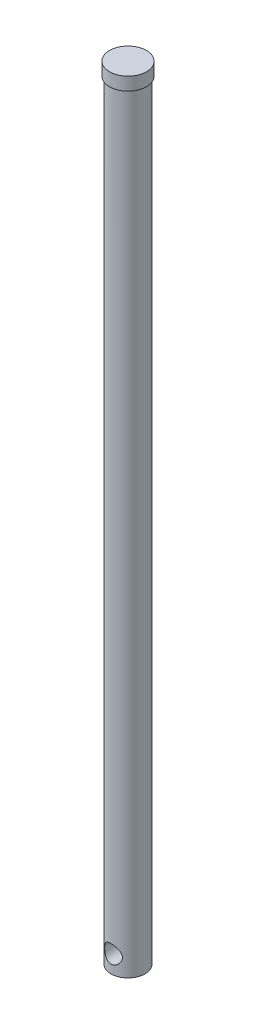
ISO-10303-21;
HEADER;
FILE_DESCRIPTION(('STEP AP214'),'2;1');
FILE_NAME('part.step','',(''),(''),'','','');
FILE_SCHEMA(('AUTOMOTIVE_DESIGN { 1 0 10303 214 1 1 1 1 }'));
ENDSEC;
DATA;
#1=APPLICATION_CONTEXT('core data for automotive mechanical design processes');
#2=APPLICATION_PROTOCOL_DEFINITION('international standard','automotive_design',2000,#1);
#3=PRODUCT_CONTEXT('',#1,'mechanical');
#4=PRODUCT('Part','Part','',(#3));
#5=PRODUCT_RELATED_PRODUCT_CATEGORY('part','',(#4));
#6=PRODUCT_DEFINITION_FORMATION('','',#4);
#7=PRODUCT_DEFINITION_CONTEXT('part definition',#1,'design');
#8=PRODUCT_DEFINITION('design','',#6,#7);
#9=PRODUCT_DEFINITION_SHAPE('','',#8);
#10=(LENGTH_UNIT() NAMED_UNIT(*) SI_UNIT(.MILLI.,.METRE.));
#11=(NAMED_UNIT(*) PLANE_ANGLE_UNIT() SI_UNIT($,.RADIAN.));
#12=(NAMED_UNIT(*) SI_UNIT($,.STERADIAN.) SOLID_ANGLE_UNIT());
#13=UNCERTAINTY_MEASURE_WITH_UNIT(LENGTH_MEASURE(1.E-05),#10,'distance_accuracy_value','');
#14=(GEOMETRIC_REPRESENTATION_CONTEXT(3) GLOBAL_UNCERTAINTY_ASSIGNED_CONTEXT((#13)) GLOBAL_UNIT_ASSIGNED_CONTEXT((#10,
#11,#12)) REPRESENTATION_CONTEXT('',''));
#15=CARTESIAN_POINT('',(0.,0.,0.));
#16=DIRECTION('',(0.,0.,1.));
#17=DIRECTION('',(1.,0.,0.));
#18=AXIS2_PLACEMENT_3D('',#15,#16,#17);
#19=CARTESIAN_POINT('',(0.,228.6,0.));
#20=DIRECTION('',(0.,-1.,0.));
#21=DIRECTION('',(0.,0.,-1.));
#22=AXIS2_PLACEMENT_3D('',#19,#20,#21);
#23=CYLINDRICAL_SURFACE('',#22,4.953);
#24=CARTESIAN_POINT('',(0.,7.67079999999999,-4.953));
#25=CARTESIAN_POINT('',(-0.135434407992874,7.67078952112055,-4.95299094755821));
#26=CARTESIAN_POINT('',(-0.271013501715402,7.66011716862036,-4.94738613543832));
#27=CARTESIAN_POINT('',(-0.538112978653829,7.61791888940756,-4.92551367096733));
#28=CARTESIAN_POINT('',(-0.669626246729192,7.58635835633592,-4.90922832411603));
#29=CARTESIAN_POINT('',(-0.924337177029192,7.50398234635794,-4.86768922872622));
#30=CARTESIAN_POINT('',(-1.04756581183996,7.45324389591742,-4.84247138195342));
#31=CARTESIAN_POINT('',(-1.28355118153246,7.33437667219869,-4.7853388344657));
#32=CARTESIAN_POINT('',(-1.396308128607,7.26624825140665,-4.7534242694923));
#33=CARTESIAN_POINT('',(-1.61631460941087,7.10957365276831,-4.68336501820389));
#34=CARTESIAN_POINT('',(-1.72274188619885,7.01999516173222,-4.64495148005103));
#35=CARTESIAN_POINT('',(-1.91983171882484,6.82519630077396,-4.56702407196095));
#36=CARTESIAN_POINT('',(-2.01048103428423,6.71996292978075,-4.52750930985845));
#37=CARTESIAN_POINT('',(-2.18135982309519,6.48595174992201,-4.44786628527983));
#38=CARTESIAN_POINT('',(-2.26000015853437,6.35592279053664,-4.40798289594909));
#39=CARTESIAN_POINT('',(-2.39398650695367,6.08209977723835,-4.33668656791211));
#40=CARTESIAN_POINT('',(-2.44935016673179,5.93831625299477,-4.30526721886033));
#41=CARTESIAN_POINT('',(-2.51152868783542,5.72011792939713,-4.26906830591823));
#42=CARTESIAN_POINT('',(-2.52852001062029,5.6493490011117,-4.25899715855717));
#43=CARTESIAN_POINT('',(-2.55653083397504,5.50625959666403,-4.2422435689365));
#44=CARTESIAN_POINT('',(-2.56755365374685,5.43394000616834,-4.23555924333185));
#45=CARTESIAN_POINT('',(-2.58343794445899,5.28843364099261,-4.22588989690386));
#46=CARTESIAN_POINT('',(-2.5883040188757,5.21524755558098,-4.22290211216722));
#47=CARTESIAN_POINT('',(-2.59181345309312,5.0686941033745,-4.22074751244465));
#48=CARTESIAN_POINT('',(-2.59045751323245,4.99532675791102,-4.22158026742571));
#49=CARTESIAN_POINT('',(-2.57825855918049,4.79565155653579,-4.2290565917176));
#50=CARTESIAN_POINT('',(-2.56121212909891,4.66979770398041,-4.23949854475852));
#51=CARTESIAN_POINT('',(-2.5093331412265,4.42317405969048,-4.27040196425953));
#52=CARTESIAN_POINT('',(-2.47449393811196,4.30240618574476,-4.29086717413281));
#53=CARTESIAN_POINT('',(-2.38746128743706,4.06584102842881,-4.33990498359995));
#54=CARTESIAN_POINT('',(-2.33488947446559,3.95022038616934,-4.36865215682474));
#55=CARTESIAN_POINT('',(-2.21418407789162,3.72887082979859,-4.43105044104316));
#56=CARTESIAN_POINT('',(-2.14604353449103,3.62314636953421,-4.46470374281502));
#57=CARTESIAN_POINT('',(-1.98499263213196,3.40894271542151,-4.53882378149797));
#58=CARTESIAN_POINT('',(-1.88994708714945,3.30216417206384,-4.57958341639906));
#59=CARTESIAN_POINT('',(-1.6832258525028,3.1053148467459,-4.65953294636479));
#60=CARTESIAN_POINT('',(-1.57154079258425,3.01525354340521,-4.69872194106864));
#61=CARTESIAN_POINT('',(-1.32695650129679,2.84966172834347,-4.77374310197551));
#62=CARTESIAN_POINT('',(-1.19322604959601,2.77520913442667,-4.80927012197356));
#63=CARTESIAN_POINT('',(-0.91281778153468,2.65049492754065,-4.87026579135199));
#64=CARTESIAN_POINT('',(-0.766151262445107,2.60021244920647,-4.89574311292645));
#65=CARTESIAN_POINT('',(-0.477822332693854,2.52970872604301,-4.93184771320455));
#66=CARTESIAN_POINT('',(-0.336850843475756,2.50723607914872,-4.94358225175026));
#67=CARTESIAN_POINT('',(-0.0526746630076387,2.48582590384199,-4.95475629186877));
#68=CARTESIAN_POINT('',(0.0905287713398937,2.48687557580309,-4.95420248012634));
#69=CARTESIAN_POINT('',(0.361891872583512,2.51129909350982,-4.94146799824639));
#70=CARTESIAN_POINT('',(0.490281106656086,2.53273350140553,-4.93029747790539));
#71=CARTESIAN_POINT('',(0.741346980819398,2.59416896175222,-4.89883922154227));
#72=CARTESIAN_POINT('',(0.864023014633658,2.63417197975948,-4.8785505203341));
#73=CARTESIAN_POINT('',(1.10395707667502,2.73249465504105,-4.82999731875451));
#74=CARTESIAN_POINT('',(1.22098847387362,2.79126739119235,-4.80153750556981));
#75=CARTESIAN_POINT('',(1.44388296552316,2.92492356856314,-4.73928511247375));
#76=CARTESIAN_POINT('',(1.54974152905531,2.99981350866252,-4.70549038285312));
#77=CARTESIAN_POINT('',(1.75908558708493,3.17260267713155,-4.6315659276384));
#78=CARTESIAN_POINT('',(1.86115768297873,3.27209136992651,-4.5911435260756));
#79=CARTESIAN_POINT('',(2.04785933403459,3.48664937051477,-4.51096732764431));
#80=CARTESIAN_POINT('',(2.13247400045246,3.60173184018457,-4.47121412782781));
#81=CARTESIAN_POINT('',(2.2868432268886,3.85296061622615,-4.39436528355432));
#82=CARTESIAN_POINT('',(2.3553707897296,3.98996517178754,-4.35758136551379));
#83=CARTESIAN_POINT('',(2.46768133354743,4.27605833052359,-4.29499074202228));
#84=CARTESIAN_POINT('',(2.51149871935443,4.42512979993947,-4.26916878630801));
#85=CARTESIAN_POINT('',(2.56888873577791,4.71561821308858,-4.23486013369095));
#86=CARTESIAN_POINT('',(2.5850013284734,4.8563568017344,-4.22492439014973));
#87=CARTESIAN_POINT('',(2.59397659950792,5.13882142154633,-4.21942422885448));
#88=CARTESIAN_POINT('',(2.5868530465231,5.28054681830729,-4.22385130034544));
#89=CARTESIAN_POINT('',(2.5519837599723,5.54396630781038,-4.24498628978715));
#90=CARTESIAN_POINT('',(2.52666059714731,5.66611354224307,-4.26024916399422));
#91=CARTESIAN_POINT('',(2.45931062999921,5.90423020583303,-4.29947787114859));
#92=CARTESIAN_POINT('',(2.41727794645893,6.02019744426488,-4.32344676703868));
#93=CARTESIAN_POINT('',(2.31465792178813,6.25115931992097,-4.37929018898568));
#94=CARTESIAN_POINT('',(2.25303244106533,6.36558882344834,-4.41158084768433));
#95=CARTESIAN_POINT('',(2.11404599840523,6.58324686275621,-4.47984546673599));
#96=CARTESIAN_POINT('',(2.03667658157849,6.68646933420897,-4.51582140099767));
#97=CARTESIAN_POINT('',(1.85596748101528,6.89356119739297,-4.59331201857542));
#98=CARTESIAN_POINT('',(1.75052042242816,6.99557253415382,-4.63490882258244));
#99=CARTESIAN_POINT('',(1.52307119960076,7.180965338379,-4.71455286882302));
#100=CARTESIAN_POINT('',(1.40105902187744,7.26433545606138,-4.75259794040427));
#101=CARTESIAN_POINT('',(1.14043186822572,7.41117195804239,-4.82182959417504));
#102=CARTESIAN_POINT('',(1.00155261732912,7.4742437135081,-4.85287703693892));
#103=CARTESIAN_POINT('',(0.785490151686321,7.55003903273763,-4.89086896186443));
#104=CARTESIAN_POINT('',(0.712228270999206,7.57216057045795,-4.90209859875253));
#105=CARTESIAN_POINT('',(0.56365594959222,7.60990056319134,-4.92139138577324));
#106=CARTESIAN_POINT('',(0.488346708037132,7.62552274111358,-4.9294563485173));
#107=CARTESIAN_POINT('',(0.344363775374576,7.64873549288647,-4.94148551932617));
#108=CARTESIAN_POINT('',(0.275826349536611,7.65699855041382,-4.94579209960719));
#109=CARTESIAN_POINT('',(0.138205185779743,7.66803353546449,-4.95155167983894));
#110=CARTESIAN_POINT('',(0.0691214364598831,7.67080534808849,-4.95300462007985));
#111=CARTESIAN_POINT('',(0.,7.67079999999999,-4.953));
#112=B_SPLINE_CURVE_WITH_KNOTS('',3,(#24,#25,#26,#27,#28,#29,#30,#31,#32,#33,#34,#35,#36,#37,
#38,#39,#40,#41,#42,#43,#44,#45,#46,#47,#48,#49,#50,#51,#52,#53,#54,#55,#56,#57,#58,#59,#60,#61,
#62,#63,#64,#65,#66,#67,#68,#69,#70,#71,#72,#73,#74,#75,#76,#77,#78,#79,#80,#81,#82,#83,#84,#85,
#86,#87,#88,#89,#90,#91,#92,#93,#94,#95,#96,#97,#98,#99,#100,#101,#102,#103,#104,#105,#106,#107,
#108,#109,#110,#111),.UNSPECIFIED.,.T.,.F.,(4,2,2,2,2,2,2,2,2,2,2,2,2,2,2,2,2,2,2,2,2,2,2,2,2,2,
2,2,2,2,2,2,2,2,2,2,2,2,2,2,2,2,2,4),(0.,0.40603491361986,0.812744212544292,1.21783706327424,
1.62292170362262,2.05409249785827,2.48562339091417,2.9546395672218,3.4232995232541,
3.64344276109151,3.86346344687526,4.08331952299962,4.30315085313085,4.68347170362396,
5.0639347020236,5.4530915516653,5.84242271037106,6.28646447664561,6.73075724916252,
7.19960035146302,7.66803798487886,8.09535461862589,8.52243873446278,8.91256977168582,
9.30274211514771,9.70315243280984,10.1037245099506,10.5463099974695,10.9892714022046,
11.4593532775918,11.9287790155281,12.3522704114358,12.7755109113269,13.1509004164362,
13.5264221187868,13.9266309363963,14.3270552461003,14.7824722738954,15.2381658336918,
15.7022476135282,15.9339909795945,16.1656014169761,16.3728244533302,16.5800518255925),.UNSPECIFIED.);
#113=CARTESIAN_POINT('',(0.,7.67079999999999,-4.953));
#114=VERTEX_POINT('',#113);
#115=EDGE_CURVE('E45',#114,#114,#112,.T.);
#116=ORIENTED_EDGE('',*,*,#115,.T.);
#117=EDGE_LOOP('',(#116));
#118=FACE_BOUND('',#117,.T.);
#119=CARTESIAN_POINT('',(2.59079999999999,5.08,4.2213699624648));
#120=CARTESIAN_POINT('',(2.59078832671894,4.94599740104169,4.22138483155383));
#121=CARTESIAN_POINT('',(2.58033187106073,4.81184249253368,4.2278502402607));
#122=CARTESIAN_POINT('',(2.53907252333815,4.54773419727038,4.25274729112539));
#123=CARTESIAN_POINT('',(2.50823086029321,4.41778931263011,4.27120173428998));
#124=CARTESIAN_POINT('',(2.42795042003139,4.16642725482374,4.31733426925371));
#125=CARTESIAN_POINT('',(2.37861798435808,4.04496594272247,4.34495951728018));
#126=CARTESIAN_POINT('',(2.26308201451216,3.81207950151802,4.40623795034252));
#127=CARTESIAN_POINT('',(2.19687627668066,3.70065568588978,4.43989192256107));
#128=CARTESIAN_POINT('',(2.04243726296212,3.47985851122549,4.51315837049116));
#129=CARTESIAN_POINT('',(1.95275013564548,3.37158907773616,4.55303441959687));
#130=CARTESIAN_POINT('',(1.75690814881966,3.17075781790369,4.63213141579228));
#131=CARTESIAN_POINT('',(1.65074443814384,3.0782044904931,4.67135199814961));
#132=CARTESIAN_POINT('',(1.41518284174805,2.90457405335406,4.74825540559866));
#133=CARTESIAN_POINT('',(1.28463591486026,2.82489104810909,4.78559854151186));
#134=CARTESIAN_POINT('',(1.00966832804024,2.68912717585647,4.85105046728886));
#135=CARTESIAN_POINT('',(0.865257321870596,2.6330300299967,4.87916562331255));
#136=CARTESIAN_POINT('',(0.578386861815757,2.55052427588923,4.9210823606692));
#137=CARTESIAN_POINT('',(0.436626572498353,2.52216930663841,4.93581604545757));
#138=CARTESIAN_POINT('',(0.149657986806267,2.48950581794469,4.95281917294147));
#139=CARTESIAN_POINT('',(0.00445207365888748,2.4851811379068,4.95509699230699));
#140=CARTESIAN_POINT('',(-0.270496255170813,2.50003562370672,4.94733882026443));
#141=CARTESIAN_POINT('',(-0.40039769705848,2.51702184771054,4.93845161565199));
#142=CARTESIAN_POINT('',(-0.655192299742309,2.57003932757373,4.91114562282726));
#143=CARTESIAN_POINT('',(-0.780085081325501,2.60607202255144,4.8927261143728));
#144=CARTESIAN_POINT('',(-1.02335708011996,2.69629708484109,4.84772742865779));
#145=CARTESIAN_POINT('',(-1.14163396701107,2.75071331337521,4.82104802042376));
#146=CARTESIAN_POINT('',(-1.36764121324187,2.87579833406023,4.76187293742561));
#147=CARTESIAN_POINT('',(-1.47536792824659,2.94647271421323,4.72937526375015));
#148=CARTESIAN_POINT('',(-1.68882454601191,3.11023222620501,4.65768168011404));
#149=CARTESIAN_POINT('',(-1.79325752905677,3.20485863250961,4.61814077855509));
#150=CARTESIAN_POINT('',(-1.98549751460079,3.4097233453686,4.53881539582432));
#151=CARTESIAN_POINT('',(-2.07328964153339,3.51997546763131,4.49903072923105));
#152=CARTESIAN_POINT('',(-2.23623976821303,3.76304072293309,4.4204331287871));
#153=CARTESIAN_POINT('',(-2.30997675426405,3.89692092510737,4.38191139372067));
#154=CARTESIAN_POINT('',(-2.40247497491795,4.10724897966894,4.33146139735931));
#155=CARTESIAN_POINT('',(-2.43029329366845,4.17895704015949,4.31586463603707));
#156=CARTESIAN_POINT('',(-2.47957444185047,4.32509084865423,4.28774128367156));
#157=CARTESIAN_POINT('',(-2.50104136782712,4.39951480999199,4.2752127145966));
#158=CARTESIAN_POINT('',(-2.53584089783621,4.5444119672798,4.25465573711517));
#159=CARTESIAN_POINT('',(-2.5496885514883,4.61472203159709,4.24634660025701));
#160=CARTESIAN_POINT('',(-2.57152777976006,4.75653095484727,4.23315688122977));
#161=CARTESIAN_POINT('',(-2.5795225489596,4.82802914345846,4.22827442879234));
#162=CARTESIAN_POINT('',(-2.58952845136904,4.97156785970009,4.22215442149639));
#163=CARTESIAN_POINT('',(-2.59154262011011,5.04360809358656,4.22091501756467));
#164=CARTESIAN_POINT('',(-2.58956873072732,5.18755178861003,4.22212478901927));
#165=CARTESIAN_POINT('',(-2.58558117763941,5.25945526074554,4.22457365404328));
#166=CARTESIAN_POINT('',(-2.5664361187488,5.4560168650101,4.23625523408484));
#167=CARTESIAN_POINT('',(-2.54515618244181,5.57992248658881,4.24919113453736));
#168=CARTESIAN_POINT('',(-2.48540189223353,5.82203727604404,4.28440842500238));
#169=CARTESIAN_POINT('',(-2.4469212127421,5.94024433053374,4.30669325290659));
#170=CARTESIAN_POINT('',(-2.35209278742112,6.17384726381136,4.35923458766652));
#171=CARTESIAN_POINT('',(-2.29501600836066,6.28887451999413,4.38980591020882));
#172=CARTESIAN_POINT('',(-2.16523022382433,6.50839340944099,4.45525144094195));
#173=CARTESIAN_POINT('',(-2.09251319372357,6.61287959376252,4.49012785403923));
#174=CARTESIAN_POINT('',(-1.92160140321405,6.82373112017973,4.56613333547405));
#175=CARTESIAN_POINT('',(-1.82126257149102,6.92829843122012,4.60745250125705));
#176=CARTESIAN_POINT('',(-1.60395094275988,7.11974618608324,4.68753261970799));
#177=CARTESIAN_POINT('',(-1.48697079397725,7.20661877128785,4.72629243056789));
#178=CARTESIAN_POINT('',(-1.23404827226985,7.36303661885776,4.79867011981334));
#179=CARTESIAN_POINT('',(-1.09756964388129,7.43183374088915,4.83204869437095));
#180=CARTESIAN_POINT('',(-0.812728767811574,7.54477695988099,4.88801283434845));
#181=CARTESIAN_POINT('',(-0.664378037597934,7.58894662493917,4.91060871564404));
#182=CARTESIAN_POINT('',(-0.375498501446054,7.64725844118155,4.94067073702701));
#183=CARTESIAN_POINT('',(-0.235603253055459,7.66389403066068,4.94939003540938));
#184=CARTESIAN_POINT('',(0.0452409559789972,7.67420801311856,4.95478071347714));
#185=CARTESIAN_POINT('',(0.186189445802367,7.66789611536338,4.95145718857972));
#186=CARTESIAN_POINT('',(0.453765136693692,7.63404386368441,4.93385516699142));
#187=CARTESIAN_POINT('',(0.58066475368152,7.60815918354714,4.92043146825401));
#188=CARTESIAN_POINT('',(0.828065231325609,7.53826823409754,4.88488932365526));
#189=CARTESIAN_POINT('',(0.94856524853077,7.49425958275004,4.86276973490967));
#190=CARTESIAN_POINT('',(1.18514967269437,7.38763253321757,4.81070531549984));
#191=CARTESIAN_POINT('',(1.30087103000042,7.32434703843598,4.78048562834144));
#192=CARTESIAN_POINT('',(1.52049325919445,7.18178712037749,4.71523654378115));
#193=CARTESIAN_POINT('',(1.62438885636174,7.10250560566517,4.68020501537628));
#194=CARTESIAN_POINT('',(1.82919183846662,6.92038860569326,4.60428413798412));
#195=CARTESIAN_POINT('',(1.92858494906651,6.81593922880044,4.56316940646045));
#196=CARTESIAN_POINT('',(2.10907983072146,6.59155854164565,4.48260856778202));
#197=CARTESIAN_POINT('',(2.19016268389521,6.47161141862103,4.4431642203085));
#198=CARTESIAN_POINT('',(2.33519595616667,6.21230349740104,4.36875849389533));
#199=CARTESIAN_POINT('',(2.39817031080441,6.07229795571459,4.33409221140452));
#200=CARTESIAN_POINT('',(2.4735859382502,5.85429875268214,4.2912011266241));
#201=CARTESIAN_POINT('',(2.49553920946564,5.78036900990611,4.2784293909852));
#202=CARTESIAN_POINT('',(2.53284502226249,5.63036301387145,4.2564512771342));
#203=CARTESIAN_POINT('',(2.54820201495479,5.55428824511318,4.24724249508994));
#204=CARTESIAN_POINT('',(2.57030178804721,5.41195409162861,4.23389886592984));
#205=CARTESIAN_POINT('',(2.57797687088609,5.3458892340923,4.22921837705718));
#206=CARTESIAN_POINT('',(2.5882290228515,5.21322882423977,4.22295014129594));
#207=CARTESIAN_POINT('',(2.59080580457818,5.14663324221816,4.22136256876035));
#208=CARTESIAN_POINT('',(2.59079999999999,5.08,4.2213699624648));
#209=B_SPLINE_CURVE_WITH_KNOTS('',3,(#119,#120,#121,#122,#123,#124,#125,#126,#127,#128,#129,
#130,#131,#132,#133,#134,#135,#136,#137,#138,#139,#140,#141,#142,#143,#144,#145,#146,#147,#148,
#149,#150,#151,#152,#153,#154,#155,#156,#157,#158,#159,#160,#161,#162,#163,#164,#165,#166,#167,
#168,#169,#170,#171,#172,#173,#174,#175,#176,#177,#178,#179,#180,#181,#182,#183,#184,#185,#186,
#187,#188,#189,#190,#191,#192,#193,#194,#195,#196,#197,#198,#199,#200,#201,#202,#203,#204,#205,
#206,#207,#208),.UNSPECIFIED.,.T.,.F.,(4,2,2,2,2,2,2,2,2,2,2,2,2,2,2,2,2,2,2,2,2,2,2,2,2,2,2,2,
2,2,2,2,2,2,2,2,2,2,2,2,2,2,2,2,4),(0.,0.40173670075462,0.804239678646085,1.2044624959857,
1.6047376093671,2.04134144161473,2.47818063306364,2.94800243542002,3.41749943448252,
3.85100241296775,4.28421382131552,4.67628720682084,5.06839022094715,5.46545123333923,
5.86264892188438,6.2999020331048,6.73754418834264,7.20766296609447,7.44280899147124,
7.67780301919248,7.89391277074791,8.10990447868984,8.32578653848911,8.54165043315069,
8.91891242492822,9.29631326946049,9.69077419021103,10.0854379839335,10.5355444190056,
10.9858503224854,11.452591574282,11.9188853918536,12.3400277387744,12.7609919177288,
13.1498517687639,13.5387627440034,13.9430530802682,14.3475230439273,14.7953519700703,
15.2436414906692,15.7128506522927,15.9470439453977,16.1810789577028,16.3808326207709,
16.5805975439694),.UNSPECIFIED.);
#210=CARTESIAN_POINT('',(2.59079999999999,5.08,4.2213699624648));
#211=VERTEX_POINT('',#210);
#212=EDGE_CURVE('E10',#211,#211,#209,.T.);
#213=ORIENTED_EDGE('',*,*,#212,.T.);
#214=EDGE_LOOP('',(#213));
#215=FACE_BOUND('',#214,.T.);
#216=CARTESIAN_POINT('',(0.,0.,0.));
#217=DIRECTION('',(0.,1.,0.));
#218=DIRECTION('',(0.,0.,1.));
#219=AXIS2_PLACEMENT_3D('',#216,#217,#218);
#220=CIRCLE('',#219,4.953);
#221=CARTESIAN_POINT('',(0.,0.,4.953));
#222=VERTEX_POINT('',#221);
#223=EDGE_CURVE('E59',#222,#222,#220,.T.);
#224=ORIENTED_EDGE('',*,*,#223,.T.);
#225=EDGE_LOOP('',(#224));
#226=FACE_BOUND('',#225,.T.);
#227=CARTESIAN_POINT('',(0.,224.79,0.));
#228=DIRECTION('',(0.,1.,0.));
#229=DIRECTION('',(0.,0.,1.));
#230=AXIS2_PLACEMENT_3D('',#227,#228,#229);
#231=CIRCLE('',#230,4.953);
#232=CARTESIAN_POINT('',(0.,224.79,4.953));
#233=VERTEX_POINT('',#232);
#234=EDGE_CURVE('E54',#233,#233,#231,.T.);
#235=ORIENTED_EDGE('',*,*,#234,.F.);
#236=EDGE_LOOP('',(#235));
#237=FACE_BOUND('',#236,.T.);
#238=ADVANCED_FACE('F41',(#118,#215,#226,#237),#23,.T.);
#239=CARTESIAN_POINT('',(0.,0.,0.));
#240=DIRECTION('',(0.,1.,0.));
#241=DIRECTION('',(0.,0.,1.));
#242=AXIS2_PLACEMENT_3D('',#239,#240,#241);
#243=PLANE('',#242);
#244=ORIENTED_EDGE('',*,*,#223,.F.);
#245=EDGE_LOOP('',(#244));
#246=FACE_BOUND('',#245,.T.);
#247=ADVANCED_FACE('F79',(#246),#243,.F.);
#248=CARTESIAN_POINT('',(0.,224.79,0.));
#249=DIRECTION('',(0.,1.,0.));
#250=DIRECTION('',(0.,0.,1.));
#251=AXIS2_PLACEMENT_3D('',#248,#249,#250);
#252=CYLINDRICAL_SURFACE('',#251,5.3975);
#253=CARTESIAN_POINT('',(0.,224.79,0.));
#254=DIRECTION('',(0.,1.,0.));
#255=DIRECTION('',(0.,0.,1.));
#256=AXIS2_PLACEMENT_3D('',#253,#254,#255);
#257=CIRCLE('',#256,5.3975);
#258=CARTESIAN_POINT('',(0.,224.79,5.3975));
#259=VERTEX_POINT('',#258);
#260=EDGE_CURVE('E93',#259,#259,#257,.T.);
#261=CARTESIAN_POINT('',(0.,228.6,0.));
#262=DIRECTION('',(0.,1.,0.));
#263=DIRECTION('',(0.,0.,1.));
#264=AXIS2_PLACEMENT_3D('',#261,#262,#263);
#265=CIRCLE('',#264,5.3975);
#266=CARTESIAN_POINT('',(0.,228.6,5.3975));
#267=VERTEX_POINT('',#266);
#268=EDGE_CURVE('E96',#267,#267,#265,.T.);
#269=CARTESIAN_POINT('',(0.,224.79,5.3975));
#270=CARTESIAN_POINT('',(0.,224.8296875,5.3975));
#271=CARTESIAN_POINT('',(0.,224.869375,5.3975));
#272=CARTESIAN_POINT('',(0.,224.94875,5.3975));
#273=CARTESIAN_POINT('',(0.,224.9884375,5.3975));
#274=CARTESIAN_POINT('',(0.,225.0678125,5.3975));
#275=CARTESIAN_POINT('',(0.,225.1075,5.3975));
#276=CARTESIAN_POINT('',(0.,225.186875,5.3975));
#277=CARTESIAN_POINT('',(0.,225.2265625,5.3975));
#278=CARTESIAN_POINT('',(0.,225.3059375,5.3975));
#279=CARTESIAN_POINT('',(0.,225.345625,5.3975));
#280=CARTESIAN_POINT('',(0.,225.425,5.3975));
#281=CARTESIAN_POINT('',(0.,225.4646875,5.3975));
#282=CARTESIAN_POINT('',(0.,225.5440625,5.3975));
#283=CARTESIAN_POINT('',(0.,225.58375,5.3975));
#284=CARTESIAN_POINT('',(0.,225.663125,5.3975));
#285=CARTESIAN_POINT('',(0.,225.7028125,5.3975));
#286=CARTESIAN_POINT('',(0.,225.7821875,5.3975));
#287=CARTESIAN_POINT('',(0.,225.821875,5.3975));
#288=CARTESIAN_POINT('',(0.,225.90125,5.3975));
#289=CARTESIAN_POINT('',(0.,225.9409375,5.3975));
#290=CARTESIAN_POINT('',(0.,226.0203125,5.3975));
#291=CARTESIAN_POINT('',(0.,226.06,5.3975));
#292=CARTESIAN_POINT('',(0.,226.139375,5.3975));
#293=CARTESIAN_POINT('',(0.,226.1790625,5.3975));
#294=CARTESIAN_POINT('',(0.,226.2584375,5.3975));
#295=CARTESIAN_POINT('',(0.,226.298125,5.3975));
#296=CARTESIAN_POINT('',(0.,226.3775,5.3975));
#297=CARTESIAN_POINT('',(0.,226.4171875,5.3975));
#298=CARTESIAN_POINT('',(0.,226.4965625,5.3975));
#299=CARTESIAN_POINT('',(0.,226.53625,5.3975));
#300=CARTESIAN_POINT('',(0.,226.615625,5.3975));
#301=CARTESIAN_POINT('',(0.,226.6553125,5.3975));
#302=CARTESIAN_POINT('',(0.,226.7346875,5.3975));
#303=CARTESIAN_POINT('',(0.,226.774375,5.3975));
#304=CARTESIAN_POINT('',(0.,226.85375,5.3975));
#305=CARTESIAN_POINT('',(0.,226.8934375,5.3975));
#306=CARTESIAN_POINT('',(0.,226.9728125,5.3975));
#307=CARTESIAN_POINT('',(0.,227.0125,5.3975));
#308=CARTESIAN_POINT('',(0.,227.091875,5.3975));
#309=CARTESIAN_POINT('',(0.,227.1315625,5.3975));
#310=CARTESIAN_POINT('',(0.,227.2109375,5.3975));
#311=CARTESIAN_POINT('',(0.,227.250625,5.3975));
#312=CARTESIAN_POINT('',(0.,227.33,5.3975));
#313=CARTESIAN_POINT('',(0.,227.3696875,5.3975));
#314=CARTESIAN_POINT('',(0.,227.4490625,5.3975));
#315=CARTESIAN_POINT('',(0.,227.48875,5.3975));
#316=CARTESIAN_POINT('',(0.,227.568125,5.3975));
#317=CARTESIAN_POINT('',(0.,227.6078125,5.3975));
#318=CARTESIAN_POINT('',(0.,227.6871875,5.3975));
#319=CARTESIAN_POINT('',(0.,227.726875,5.3975));
#320=CARTESIAN_POINT('',(0.,227.80625,5.3975));
#321=CARTESIAN_POINT('',(0.,227.8459375,5.3975));
#322=CARTESIAN_POINT('',(0.,227.9253125,5.3975));
#323=CARTESIAN_POINT('',(0.,227.965,5.3975));
#324=CARTESIAN_POINT('',(0.,228.044375,5.3975));
#325=CARTESIAN_POINT('',(0.,228.0840625,5.3975));
#326=CARTESIAN_POINT('',(0.,228.1634375,5.3975));
#327=CARTESIAN_POINT('',(0.,228.203125,5.3975));
#328=CARTESIAN_POINT('',(0.,228.2825,5.3975));
#329=CARTESIAN_POINT('',(0.,228.3221875,5.3975));
#330=CARTESIAN_POINT('',(0.,228.4015625,5.3975));
#331=CARTESIAN_POINT('',(0.,228.44125,5.3975));
#332=CARTESIAN_POINT('',(0.,228.520625,5.3975));
#333=CARTESIAN_POINT('',(0.,228.5603125,5.3975));
#334=CARTESIAN_POINT('',(0.,228.6,5.3975));
#335=B_SPLINE_CURVE_WITH_KNOTS('',3,(#269,#270,#271,#272,#273,#274,#275,#276,#277,#278,#279,
#280,#281,#282,#283,#284,#285,#286,#287,#288,#289,#290,#291,#292,#293,#294,#295,#296,#297,#298,
#299,#300,#301,#302,#303,#304,#305,#306,#307,#308,#309,#310,#311,#312,#313,#314,#315,#316,#317,
#318,#319,#320,#321,#322,#323,#324,#325,#326,#327,#328,#329,#330,#331,#332,#333,#334),
.UNSPECIFIED.,.F.,.F.,(4,2,2,2,2,2,2,2,2,2,2,2,2,2,2,2,2,2,2,2,2,2,2,2,2,2,2,2,2,2,2,2,4),(0.,
0.119062499999989,0.238124999999978,0.357187499999995,0.476249999999984,0.5953125,
0.714374999999989,0.833437499999978,0.952499999999995,1.07156249999998,1.190625,
1.30968749999999,1.42874999999998,1.5478125,1.66687499999998,1.7859375,1.90499999999999,
2.02406249999998,2.143125,2.26218749999998,2.38125,2.50031249999999,2.61937499999998,2.7384375,
2.85749999999998,2.9765625,3.09562499999999,3.21468749999998,3.33375,3.45281249999999,3.571875,
3.69093749999999,3.81000000000001),.UNSPECIFIED.);
#336=EDGE_CURVE('BSEAM75',#259,#267,#335,.T.);
#337=ORIENTED_EDGE('',*,*,#260,.T.);
#338=ORIENTED_EDGE('',*,*,#268,.F.);
#339=ORIENTED_EDGE('',*,*,#336,.T.);
#340=ORIENTED_EDGE('',*,*,#336,.F.);
#341=EDGE_LOOP('',(#337,#339,#338,#340));
#342=FACE_BOUND('',#341,.T.);
#343=ADVANCED_FACE('F75',(#342),#252,.T.);
#344=CARTESIAN_POINT('',(0.,224.79,0.));
#345=DIRECTION('',(0.,1.,0.));
#346=DIRECTION('',(0.,0.,1.));
#347=AXIS2_PLACEMENT_3D('',#344,#345,#346);
#348=PLANE('',#347);
#349=ORIENTED_EDGE('',*,*,#234,.T.);
#350=EDGE_LOOP('',(#349));
#351=FACE_BOUND('',#350,.T.);
#352=ORIENTED_EDGE('',*,*,#260,.F.);
#353=EDGE_LOOP('',(#352));
#354=FACE_BOUND('',#353,.T.);
#355=ADVANCED_FACE('F71',(#351,#354),#348,.F.);
#356=CARTESIAN_POINT('',(0.,228.6,0.));
#357=DIRECTION('',(0.,1.,0.));
#358=DIRECTION('',(0.,0.,1.));
#359=AXIS2_PLACEMENT_3D('',#356,#357,#358);
#360=PLANE('',#359);
#361=ORIENTED_EDGE('',*,*,#268,.T.);
#362=EDGE_LOOP('',(#361));
#363=FACE_BOUND('',#362,.T.);
#364=ADVANCED_FACE('F69',(#363),#360,.T.);
#365=CARTESIAN_POINT('',(0.,5.08,4.953));
#366=DIRECTION('',(0.,0.,1.));
#367=DIRECTION('',(1.,0.,0.));
#368=AXIS2_PLACEMENT_3D('',#365,#366,#367);
#369=CYLINDRICAL_SURFACE('',#368,2.59079999999999);
#370=ORIENTED_EDGE('',*,*,#212,.F.);
#371=EDGE_LOOP('',(#370));
#372=FACE_BOUND('',#371,.T.);
#373=ORIENTED_EDGE('',*,*,#115,.F.);
#374=EDGE_LOOP('',(#373));
#375=FACE_BOUND('',#374,.T.);
#376=ADVANCED_FACE('F65',(#372,#375),#369,.F.);
#377=CLOSED_SHELL('',(#238,#247,#343,#355,#364,#376));
#378=MANIFOLD_SOLID_BREP('B2',#377);
#379=ADVANCED_BREP_SHAPE_REPRESENTATION('',(#18,#378),#14);
#380=SHAPE_DEFINITION_REPRESENTATION(#9,#379);
ENDSEC;
END-ISO-10303-21;
